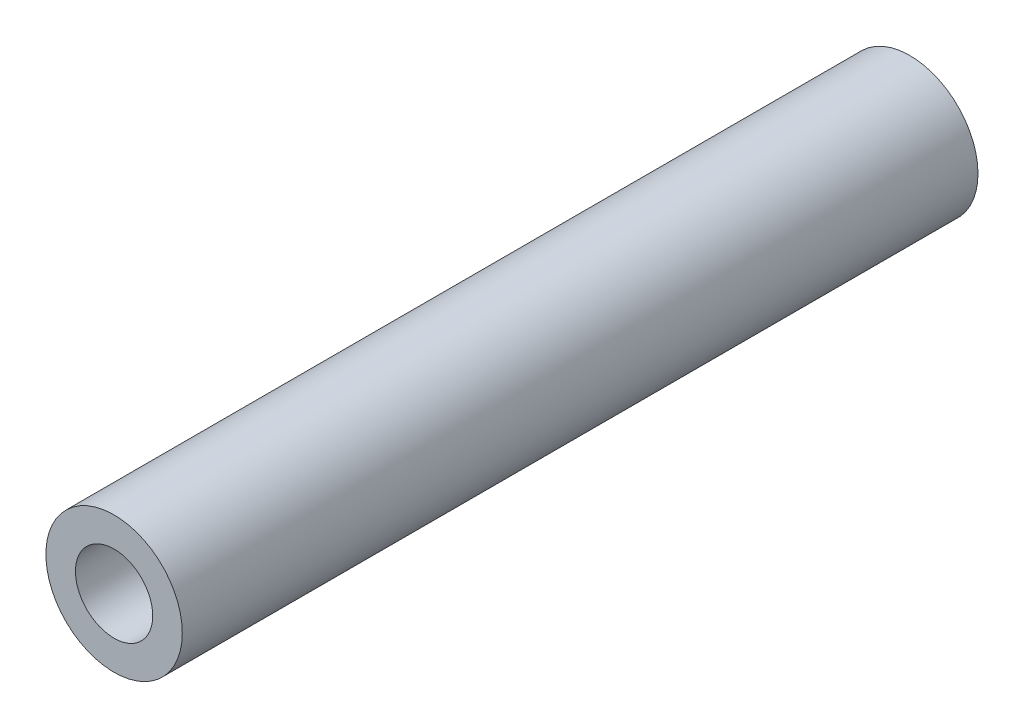
ISO-10303-21;
HEADER;
FILE_DESCRIPTION(('STEP AP214'),'2;1');
FILE_NAME('part.step','',(''),(''),'','','');
FILE_SCHEMA(('AUTOMOTIVE_DESIGN { 1 0 10303 214 1 1 1 1 }'));
ENDSEC;
DATA;
#1=APPLICATION_CONTEXT('core data for automotive mechanical design processes');
#2=APPLICATION_PROTOCOL_DEFINITION('international standard','automotive_design',2000,#1);
#3=PRODUCT_CONTEXT('',#1,'mechanical');
#4=PRODUCT('Part','Part','',(#3));
#5=PRODUCT_RELATED_PRODUCT_CATEGORY('part','',(#4));
#6=PRODUCT_DEFINITION_FORMATION('','',#4);
#7=PRODUCT_DEFINITION_CONTEXT('part definition',#1,'design');
#8=PRODUCT_DEFINITION('design','',#6,#7);
#9=PRODUCT_DEFINITION_SHAPE('','',#8);
#10=(LENGTH_UNIT() NAMED_UNIT(*) SI_UNIT(.MILLI.,.METRE.));
#11=(NAMED_UNIT(*) PLANE_ANGLE_UNIT() SI_UNIT($,.RADIAN.));
#12=(NAMED_UNIT(*) SI_UNIT($,.STERADIAN.) SOLID_ANGLE_UNIT());
#13=UNCERTAINTY_MEASURE_WITH_UNIT(LENGTH_MEASURE(1.E-05),#10,'distance_accuracy_value','');
#14=(GEOMETRIC_REPRESENTATION_CONTEXT(3) GLOBAL_UNCERTAINTY_ASSIGNED_CONTEXT((#13)) GLOBAL_UNIT_ASSIGNED_CONTEXT((#10,
#11,#12)) REPRESENTATION_CONTEXT('',''));
#15=CARTESIAN_POINT('',(0.,0.,0.));
#16=DIRECTION('',(0.,0.,1.));
#17=DIRECTION('',(1.,0.,0.));
#18=AXIS2_PLACEMENT_3D('',#15,#16,#17);
#19=CARTESIAN_POINT('',(0.,0.,35.));
#20=DIRECTION('',(0.,0.,1.));
#21=DIRECTION('',(1.,0.,0.));
#22=AXIS2_PLACEMENT_3D('',#19,#20,#21);
#23=PLANE('',#22);
#24=CARTESIAN_POINT('',(0.,0.,35.));
#25=DIRECTION('',(0.,0.,1.));
#26=DIRECTION('',(1.,0.,0.));
#27=AXIS2_PLACEMENT_3D('',#24,#25,#26);
#28=CIRCLE('',#27,3.);
#29=CARTESIAN_POINT('',(3.,0.,35.));
#30=VERTEX_POINT('',#29);
#31=EDGE_CURVE('E10',#30,#30,#28,.T.);
#32=ORIENTED_EDGE('',*,*,#31,.T.);
#33=EDGE_LOOP('',(#32));
#34=FACE_BOUND('',#33,.T.);
#35=CARTESIAN_POINT('',(0.,0.,35.));
#36=DIRECTION('',(0.,0.,1.));
#37=DIRECTION('',(1.,0.,0.));
#38=AXIS2_PLACEMENT_3D('',#35,#36,#37);
#39=CIRCLE('',#38,1.7);
#40=CARTESIAN_POINT('',(1.7,0.,35.));
#41=VERTEX_POINT('',#40);
#42=EDGE_CURVE('E48',#41,#41,#39,.T.);
#43=ORIENTED_EDGE('',*,*,#42,.F.);
#44=EDGE_LOOP('',(#43));
#45=FACE_BOUND('',#44,.T.);
#46=ADVANCED_FACE('F40',(#34,#45),#23,.T.);
#47=CARTESIAN_POINT('',(0.,0.,0.));
#48=DIRECTION('',(0.,0.,1.));
#49=DIRECTION('',(1.,0.,0.));
#50=AXIS2_PLACEMENT_3D('',#47,#48,#49);
#51=PLANE('',#50);
#52=CARTESIAN_POINT('',(0.,0.,0.));
#53=DIRECTION('',(0.,0.,1.));
#54=DIRECTION('',(1.,0.,0.));
#55=AXIS2_PLACEMENT_3D('',#52,#53,#54);
#56=CIRCLE('',#55,3.);
#57=CARTESIAN_POINT('',(3.,0.,0.));
#58=VERTEX_POINT('',#57);
#59=EDGE_CURVE('E41',#58,#58,#56,.T.);
#60=ORIENTED_EDGE('',*,*,#59,.F.);
#61=EDGE_LOOP('',(#60));
#62=FACE_BOUND('',#61,.T.);
#63=CARTESIAN_POINT('',(0.,0.,0.));
#64=DIRECTION('',(0.,0.,1.));
#65=DIRECTION('',(1.,0.,0.));
#66=AXIS2_PLACEMENT_3D('',#63,#64,#65);
#67=CIRCLE('',#66,1.7);
#68=CARTESIAN_POINT('',(1.7,0.,0.));
#69=VERTEX_POINT('',#68);
#70=EDGE_CURVE('E49',#69,#69,#67,.T.);
#71=ORIENTED_EDGE('',*,*,#70,.T.);
#72=EDGE_LOOP('',(#71));
#73=FACE_BOUND('',#72,.T.);
#74=ADVANCED_FACE('F58',(#62,#73),#51,.F.);
#75=CARTESIAN_POINT('',(0.,0.,35.));
#76=DIRECTION('',(0.,0.,-1.));
#77=DIRECTION('',(-1.,0.,0.));
#78=AXIS2_PLACEMENT_3D('',#75,#76,#77);
#79=CYLINDRICAL_SURFACE('',#78,3.);
#80=ORIENTED_EDGE('',*,*,#31,.F.);
#81=EDGE_LOOP('',(#80));
#82=FACE_BOUND('',#81,.T.);
#83=ORIENTED_EDGE('',*,*,#59,.T.);
#84=EDGE_LOOP('',(#83));
#85=FACE_BOUND('',#84,.T.);
#86=ADVANCED_FACE('F39',(#82,#85),#79,.T.);
#87=CARTESIAN_POINT('',(0.,0.,35.));
#88=DIRECTION('',(0.,0.,-1.));
#89=DIRECTION('',(-1.,0.,0.));
#90=AXIS2_PLACEMENT_3D('',#87,#88,#89);
#91=CYLINDRICAL_SURFACE('',#90,1.7);
#92=ORIENTED_EDGE('',*,*,#42,.T.);
#93=EDGE_LOOP('',(#92));
#94=FACE_BOUND('',#93,.T.);
#95=ORIENTED_EDGE('',*,*,#70,.F.);
#96=EDGE_LOOP('',(#95));
#97=FACE_BOUND('',#96,.T.);
#98=ADVANCED_FACE('F57',(#94,#97),#91,.F.);
#99=CLOSED_SHELL('',(#46,#74,#86,#98));
#100=MANIFOLD_SOLID_BREP('B2',#99);
#101=ADVANCED_BREP_SHAPE_REPRESENTATION('',(#18,#100),#14);
#102=SHAPE_DEFINITION_REPRESENTATION(#9,#101);
ENDSEC;
END-ISO-10303-21;
